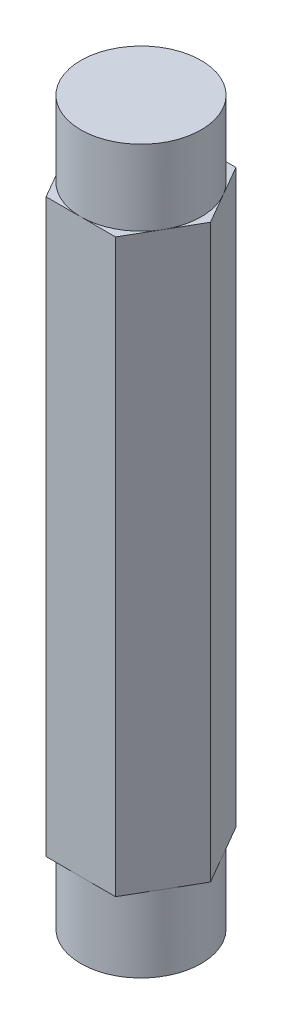
ISO-10303-21;
HEADER;
FILE_DESCRIPTION(('STEP AP214'),'2;1');
FILE_NAME('part.step','',(''),(''),'','','');
FILE_SCHEMA(('AUTOMOTIVE_DESIGN { 1 0 10303 214 1 1 1 1 }'));
ENDSEC;
DATA;
#1=APPLICATION_CONTEXT('core data for automotive mechanical design processes');
#2=APPLICATION_PROTOCOL_DEFINITION('international standard','automotive_design',2000,#1);
#3=PRODUCT_CONTEXT('',#1,'mechanical');
#4=PRODUCT('Part','Part','',(#3));
#5=PRODUCT_RELATED_PRODUCT_CATEGORY('part','',(#4));
#6=PRODUCT_DEFINITION_FORMATION('','',#4);
#7=PRODUCT_DEFINITION_CONTEXT('part definition',#1,'design');
#8=PRODUCT_DEFINITION('design','',#6,#7);
#9=PRODUCT_DEFINITION_SHAPE('','',#8);
#10=(LENGTH_UNIT() NAMED_UNIT(*) SI_UNIT(.MILLI.,.METRE.));
#11=(NAMED_UNIT(*) PLANE_ANGLE_UNIT() SI_UNIT($,.RADIAN.));
#12=(NAMED_UNIT(*) SI_UNIT($,.STERADIAN.) SOLID_ANGLE_UNIT());
#13=UNCERTAINTY_MEASURE_WITH_UNIT(LENGTH_MEASURE(1.E-05),#10,'distance_accuracy_value','');
#14=(GEOMETRIC_REPRESENTATION_CONTEXT(3) GLOBAL_UNCERTAINTY_ASSIGNED_CONTEXT((#13)) GLOBAL_UNIT_ASSIGNED_CONTEXT((#10,
#11,#12)) REPRESENTATION_CONTEXT('',''));
#15=CARTESIAN_POINT('',(0.,0.,0.));
#16=DIRECTION('',(0.,0.,1.));
#17=DIRECTION('',(1.,0.,0.));
#18=AXIS2_PLACEMENT_3D('',#15,#16,#17);
#19=CARTESIAN_POINT('',(-3.66617420935412,38.1,6.35));
#20=DIRECTION('',(0.,0.,-1.));
#21=DIRECTION('',(-1.,0.,0.));
#22=AXIS2_PLACEMENT_3D('',#19,#20,#21);
#23=PLANE('',#22);
#24=DIRECTION('',(-1.,0.,0.));
#25=VECTOR('',#24,1.);
#26=CARTESIAN_POINT('',(-3.66617420935412,-30.1498,6.35));
#27=LINE('',#26,#25);
#28=CARTESIAN_POINT('',(3.66617420935413,-30.1498,6.35));
#29=VERTEX_POINT('',#28);
#30=CARTESIAN_POINT('',(0.,-30.1498,6.35));
#31=VERTEX_POINT('',#30);
#32=EDGE_CURVE('E138',#29,#31,#27,.T.);
#33=ORIENTED_EDGE('',*,*,#32,.F.);
#34=DIRECTION('',(0.,-1.,0.));
#35=VECTOR('',#34,1.);
#36=CARTESIAN_POINT('',(3.66617420935412,38.1,6.35));
#37=LINE('',#36,#35);
#38=CARTESIAN_POINT('',(3.66617420935412,30.1498,6.35));
#39=VERTEX_POINT('',#38);
#40=EDGE_CURVE('E232',#39,#29,#37,.T.);
#41=ORIENTED_EDGE('',*,*,#40,.F.);
#42=DIRECTION('',(1.,0.,0.));
#43=VECTOR('',#42,1.);
#44=CARTESIAN_POINT('',(-3.66617420935412,30.1498,6.35));
#45=LINE('',#44,#43);
#46=CARTESIAN_POINT('',(0.,30.1498,6.35));
#47=VERTEX_POINT('',#46);
#48=EDGE_CURVE('E210',#47,#39,#45,.T.);
#49=ORIENTED_EDGE('',*,*,#48,.F.);
#50=CARTESIAN_POINT('',(-3.66617420935412,30.1498,6.35));
#51=VERTEX_POINT('',#50);
#52=EDGE_CURVE('E213',#51,#47,#45,.T.);
#53=ORIENTED_EDGE('',*,*,#52,.F.);
#54=DIRECTION('',(0.,-1.,0.));
#55=VECTOR('',#54,1.);
#56=CARTESIAN_POINT('',(-3.66617420935412,38.1,6.35));
#57=LINE('',#56,#55);
#58=CARTESIAN_POINT('',(-3.66617420935412,-30.1498,6.35));
#59=VERTEX_POINT('',#58);
#60=EDGE_CURVE('E172',#51,#59,#57,.T.);
#61=ORIENTED_EDGE('',*,*,#60,.T.);
#62=EDGE_CURVE('E151',#31,#59,#27,.T.);
#63=ORIENTED_EDGE('',*,*,#62,.F.);
#64=EDGE_LOOP('',(#33,#41,#49,#53,#61,#63));
#65=FACE_BOUND('',#64,.T.);
#66=ADVANCED_FACE('F47',(#65),#23,.F.);
#67=CARTESIAN_POINT('',(3.66617420935412,38.1,6.35));
#68=DIRECTION('',(-0.866025403784439,0.,-0.5));
#69=DIRECTION('',(-0.5,0.,0.866025403784439));
#70=AXIS2_PLACEMENT_3D('',#67,#68,#69);
#71=PLANE('',#70);
#72=DIRECTION('',(-0.5,0.,0.866025403784439));
#73=VECTOR('',#72,1.);
#74=CARTESIAN_POINT('',(3.66617420935412,-30.1498,6.35));
#75=LINE('',#74,#73);
#76=CARTESIAN_POINT('',(7.33234841870825,-30.1498,0.));
#77=VERTEX_POINT('',#76);
#78=CARTESIAN_POINT('',(5.49926131403119,-30.1498,3.175));
#79=VERTEX_POINT('',#78);
#80=EDGE_CURVE('E183',#77,#79,#75,.T.);
#81=ORIENTED_EDGE('',*,*,#80,.F.);
#82=DIRECTION('',(0.,-1.,0.));
#83=VECTOR('',#82,1.);
#84=CARTESIAN_POINT('',(7.33234841870825,38.1,0.));
#85=LINE('',#84,#83);
#86=CARTESIAN_POINT('',(7.33234841870825,30.1498,0.));
#87=VERTEX_POINT('',#86);
#88=EDGE_CURVE('E228',#87,#77,#85,.T.);
#89=ORIENTED_EDGE('',*,*,#88,.F.);
#90=DIRECTION('',(0.5,0.,-0.866025403784439));
#91=VECTOR('',#90,1.);
#92=CARTESIAN_POINT('',(3.66617420935412,30.1498,6.35));
#93=LINE('',#92,#91);
#94=CARTESIAN_POINT('',(5.49926131403119,30.1498,3.175));
#95=VERTEX_POINT('',#94);
#96=EDGE_CURVE('E206',#95,#87,#93,.T.);
#97=ORIENTED_EDGE('',*,*,#96,.F.);
#98=EDGE_CURVE('E209',#39,#95,#93,.T.);
#99=ORIENTED_EDGE('',*,*,#98,.F.);
#100=ORIENTED_EDGE('',*,*,#40,.T.);
#101=EDGE_CURVE('E144',#79,#29,#75,.T.);
#102=ORIENTED_EDGE('',*,*,#101,.F.);
#103=EDGE_LOOP('',(#81,#89,#97,#99,#100,#102));
#104=FACE_BOUND('',#103,.T.);
#105=ADVANCED_FACE('F321',(#104),#71,.F.);
#106=CARTESIAN_POINT('',(7.33234841870825,38.1,0.));
#107=DIRECTION('',(-0.866025403784439,0.,0.5));
#108=DIRECTION('',(0.5,0.,0.866025403784439));
#109=AXIS2_PLACEMENT_3D('',#106,#107,#108);
#110=PLANE('',#109);
#111=DIRECTION('',(0.5,0.,0.866025403784439));
#112=VECTOR('',#111,1.);
#113=CARTESIAN_POINT('',(7.33234841870825,-30.1498,0.));
#114=LINE('',#113,#112);
#115=CARTESIAN_POINT('',(3.66617420935412,-30.1498,-6.35));
#116=VERTEX_POINT('',#115);
#117=CARTESIAN_POINT('',(5.49926131403119,-30.1498,-3.175));
#118=VERTEX_POINT('',#117);
#119=EDGE_CURVE('E187',#116,#118,#114,.T.);
#120=ORIENTED_EDGE('',*,*,#119,.F.);
#121=DIRECTION('',(0.,-1.,0.));
#122=VECTOR('',#121,1.);
#123=CARTESIAN_POINT('',(3.66617420935412,38.1,-6.35));
#124=LINE('',#123,#122);
#125=CARTESIAN_POINT('',(3.66617420935412,30.1498,-6.35));
#126=VERTEX_POINT('',#125);
#127=EDGE_CURVE('E224',#126,#116,#124,.T.);
#128=ORIENTED_EDGE('',*,*,#127,.F.);
#129=DIRECTION('',(-0.5,0.,-0.866025403784439));
#130=VECTOR('',#129,1.);
#131=CARTESIAN_POINT('',(7.33234841870825,30.1498,0.));
#132=LINE('',#131,#130);
#133=CARTESIAN_POINT('',(5.49926131403119,30.1498,-3.175));
#134=VERTEX_POINT('',#133);
#135=EDGE_CURVE('E202',#134,#126,#132,.T.);
#136=ORIENTED_EDGE('',*,*,#135,.F.);
#137=EDGE_CURVE('E205',#87,#134,#132,.T.);
#138=ORIENTED_EDGE('',*,*,#137,.F.);
#139=ORIENTED_EDGE('',*,*,#88,.T.);
#140=EDGE_CURVE('E184',#118,#77,#114,.T.);
#141=ORIENTED_EDGE('',*,*,#140,.F.);
#142=EDGE_LOOP('',(#120,#128,#136,#138,#139,#141));
#143=FACE_BOUND('',#142,.T.);
#144=ADVANCED_FACE('F305',(#143),#110,.F.);
#145=CARTESIAN_POINT('',(3.66617420935412,38.1,-6.35));
#146=DIRECTION('',(0.,0.,1.));
#147=DIRECTION('',(1.,0.,0.));
#148=AXIS2_PLACEMENT_3D('',#145,#146,#147);
#149=PLANE('',#148);
#150=DIRECTION('',(1.,0.,0.));
#151=VECTOR('',#150,1.);
#152=CARTESIAN_POINT('',(3.66617420935412,-30.1498,-6.35));
#153=LINE('',#152,#151);
#154=CARTESIAN_POINT('',(-3.66617420935412,-30.1498,-6.35));
#155=VERTEX_POINT('',#154);
#156=CARTESIAN_POINT('',(0.,-30.1498,-6.35));
#157=VERTEX_POINT('',#156);
#158=EDGE_CURVE('E177',#155,#157,#153,.T.);
#159=ORIENTED_EDGE('',*,*,#158,.F.);
#160=DIRECTION('',(0.,-1.,0.));
#161=VECTOR('',#160,1.);
#162=CARTESIAN_POINT('',(-3.66617420935412,38.1,-6.35));
#163=LINE('',#162,#161);
#164=CARTESIAN_POINT('',(-3.66617420935412,30.1498,-6.35));
#165=VERTEX_POINT('',#164);
#166=EDGE_CURVE('E220',#165,#155,#163,.T.);
#167=ORIENTED_EDGE('',*,*,#166,.F.);
#168=DIRECTION('',(-1.,0.,0.));
#169=VECTOR('',#168,1.);
#170=CARTESIAN_POINT('',(3.66617420935412,30.1498,-6.35));
#171=LINE('',#170,#169);
#172=CARTESIAN_POINT('',(0.,30.1498,-6.35));
#173=VERTEX_POINT('',#172);
#174=EDGE_CURVE('E198',#173,#165,#171,.T.);
#175=ORIENTED_EDGE('',*,*,#174,.F.);
#176=EDGE_CURVE('E201',#126,#173,#171,.T.);
#177=ORIENTED_EDGE('',*,*,#176,.F.);
#178=ORIENTED_EDGE('',*,*,#127,.T.);
#179=EDGE_CURVE('E180',#157,#116,#153,.T.);
#180=ORIENTED_EDGE('',*,*,#179,.F.);
#181=EDGE_LOOP('',(#159,#167,#175,#177,#178,#180));
#182=FACE_BOUND('',#181,.T.);
#183=ADVANCED_FACE('F291',(#182),#149,.F.);
#184=CARTESIAN_POINT('',(-3.66617420935412,38.1,-6.35));
#185=DIRECTION('',(0.866025403784439,0.,0.5));
#186=DIRECTION('',(0.5,0.,-0.866025403784439));
#187=AXIS2_PLACEMENT_3D('',#184,#185,#186);
#188=PLANE('',#187);
#189=DIRECTION('',(0.5,0.,-0.866025403784439));
#190=VECTOR('',#189,1.);
#191=CARTESIAN_POINT('',(-3.66617420935412,-30.1498,-6.35));
#192=LINE('',#191,#190);
#193=CARTESIAN_POINT('',(-7.33234841870825,-30.1498,0.));
#194=VERTEX_POINT('',#193);
#195=CARTESIAN_POINT('',(-5.49926131403118,-30.1498,-3.175));
#196=VERTEX_POINT('',#195);
#197=EDGE_CURVE('E168',#194,#196,#192,.T.);
#198=ORIENTED_EDGE('',*,*,#197,.F.);
#199=DIRECTION('',(0.,-1.,0.));
#200=VECTOR('',#199,1.);
#201=CARTESIAN_POINT('',(-7.33234841870825,38.1,0.));
#202=LINE('',#201,#200);
#203=CARTESIAN_POINT('',(-7.33234841870825,30.1498,0.));
#204=VERTEX_POINT('',#203);
#205=EDGE_CURVE('E216',#204,#194,#202,.T.);
#206=ORIENTED_EDGE('',*,*,#205,.F.);
#207=DIRECTION('',(-0.5,0.,0.866025403784439));
#208=VECTOR('',#207,1.);
#209=CARTESIAN_POINT('',(-3.66617420935412,30.1498,-6.35));
#210=LINE('',#209,#208);
#211=CARTESIAN_POINT('',(-5.49926131403118,30.1498,-3.175));
#212=VERTEX_POINT('',#211);
#213=EDGE_CURVE('E192',#212,#204,#210,.T.);
#214=ORIENTED_EDGE('',*,*,#213,.F.);
#215=EDGE_CURVE('E197',#165,#212,#210,.T.);
#216=ORIENTED_EDGE('',*,*,#215,.F.);
#217=ORIENTED_EDGE('',*,*,#166,.T.);
#218=EDGE_CURVE('E150',#196,#155,#192,.T.);
#219=ORIENTED_EDGE('',*,*,#218,.F.);
#220=EDGE_LOOP('',(#198,#206,#214,#216,#217,#219));
#221=FACE_BOUND('',#220,.T.);
#222=ADVANCED_FACE('F294',(#221),#188,.F.);
#223=CARTESIAN_POINT('',(-7.33234841870825,38.1,0.));
#224=DIRECTION('',(0.866025403784439,0.,-0.5));
#225=DIRECTION('',(-0.5,0.,-0.866025403784439));
#226=AXIS2_PLACEMENT_3D('',#223,#224,#225);
#227=PLANE('',#226);
#228=DIRECTION('',(-0.5,0.,-0.866025403784439));
#229=VECTOR('',#228,1.);
#230=CARTESIAN_POINT('',(-7.33234841870825,-30.1498,0.));
#231=LINE('',#230,#229);
#232=CARTESIAN_POINT('',(-5.49926131403119,-30.1498,3.175));
#233=VERTEX_POINT('',#232);
#234=EDGE_CURVE('E12',#59,#233,#231,.T.);
#235=ORIENTED_EDGE('',*,*,#234,.F.);
#236=ORIENTED_EDGE('',*,*,#60,.F.);
#237=DIRECTION('',(0.5,0.,0.866025403784439));
#238=VECTOR('',#237,1.);
#239=CARTESIAN_POINT('',(-7.33234841870825,30.1498,0.));
#240=LINE('',#239,#238);
#241=CARTESIAN_POINT('',(-5.49926131403119,30.1498,3.175));
#242=VERTEX_POINT('',#241);
#243=EDGE_CURVE('E239',#242,#51,#240,.T.);
#244=ORIENTED_EDGE('',*,*,#243,.F.);
#245=EDGE_CURVE('E241',#204,#242,#240,.T.);
#246=ORIENTED_EDGE('',*,*,#245,.F.);
#247=ORIENTED_EDGE('',*,*,#205,.T.);
#248=EDGE_CURVE('E50',#233,#194,#231,.T.);
#249=ORIENTED_EDGE('',*,*,#248,.F.);
#250=EDGE_LOOP('',(#235,#236,#244,#246,#247,#249));
#251=FACE_BOUND('',#250,.T.);
#252=ADVANCED_FACE('F257',(#251),#227,.F.);
#253=CARTESIAN_POINT('',(0.,30.1498,0.));
#254=DIRECTION('',(0.,1.,0.));
#255=DIRECTION('',(0.,0.,1.));
#256=AXIS2_PLACEMENT_3D('',#253,#254,#255);
#257=PLANE('',#256);
#258=ORIENTED_EDGE('',*,*,#52,.T.);
#259=CARTESIAN_POINT('',(0.,30.1498,0.));
#260=DIRECTION('',(0.,1.,0.));
#261=DIRECTION('',(0.,0.,1.));
#262=AXIS2_PLACEMENT_3D('',#259,#260,#261);
#263=CIRCLE('',#262,6.35);
#264=EDGE_CURVE('E194',#242,#47,#263,.T.);
#265=ORIENTED_EDGE('',*,*,#264,.F.);
#266=ORIENTED_EDGE('',*,*,#243,.T.);
#267=EDGE_LOOP('',(#258,#265,#266));
#268=FACE_BOUND('',#267,.T.);
#269=ADVANCED_FACE('F259',(#268),#257,.T.);
#270=ORIENTED_EDGE('',*,*,#48,.T.);
#271=ORIENTED_EDGE('',*,*,#98,.T.);
#272=EDGE_CURVE('E188',#47,#95,#263,.T.);
#273=ORIENTED_EDGE('',*,*,#272,.F.);
#274=EDGE_LOOP('',(#270,#271,#273));
#275=FACE_BOUND('',#274,.T.);
#276=ADVANCED_FACE('F331',(#275),#257,.T.);
#277=ORIENTED_EDGE('',*,*,#96,.T.);
#278=ORIENTED_EDGE('',*,*,#137,.T.);
#279=EDGE_CURVE('E193',#95,#134,#263,.T.);
#280=ORIENTED_EDGE('',*,*,#279,.F.);
#281=EDGE_LOOP('',(#277,#278,#280));
#282=FACE_BOUND('',#281,.T.);
#283=ADVANCED_FACE('F325',(#282),#257,.T.);
#284=ORIENTED_EDGE('',*,*,#135,.T.);
#285=ORIENTED_EDGE('',*,*,#176,.T.);
#286=EDGE_CURVE('E269',#134,#173,#263,.T.);
#287=ORIENTED_EDGE('',*,*,#286,.F.);
#288=EDGE_LOOP('',(#284,#285,#287));
#289=FACE_BOUND('',#288,.T.);
#290=ADVANCED_FACE('F326',(#289),#257,.T.);
#291=ORIENTED_EDGE('',*,*,#174,.T.);
#292=ORIENTED_EDGE('',*,*,#215,.T.);
#293=EDGE_CURVE('E272',#173,#212,#263,.T.);
#294=ORIENTED_EDGE('',*,*,#293,.F.);
#295=EDGE_LOOP('',(#291,#292,#294));
#296=FACE_BOUND('',#295,.T.);
#297=ADVANCED_FACE('F297',(#296),#257,.T.);
#298=ORIENTED_EDGE('',*,*,#213,.T.);
#299=ORIENTED_EDGE('',*,*,#245,.T.);
#300=EDGE_CURVE('E70',#212,#242,#263,.T.);
#301=ORIENTED_EDGE('',*,*,#300,.F.);
#302=EDGE_LOOP('',(#298,#299,#301));
#303=FACE_BOUND('',#302,.T.);
#304=ADVANCED_FACE('F253',(#303),#257,.T.);
#305=CARTESIAN_POINT('',(0.,30.1498,0.));
#306=DIRECTION('',(0.,1.,0.));
#307=DIRECTION('',(0.,0.,1.));
#308=AXIS2_PLACEMENT_3D('',#305,#306,#307);
#309=CYLINDRICAL_SURFACE('',#308,6.35);
#310=CARTESIAN_POINT('',(0.,38.1,0.));
#311=DIRECTION('',(0.,1.,0.));
#312=DIRECTION('',(0.,0.,1.));
#313=AXIS2_PLACEMENT_3D('',#310,#311,#312);
#314=CIRCLE('',#313,6.35);
#315=CARTESIAN_POINT('',(0.,38.1,6.35));
#316=VERTEX_POINT('',#315);
#317=EDGE_CURVE('E235',#316,#316,#314,.T.);
#318=ORIENTED_EDGE('',*,*,#317,.F.);
#319=EDGE_LOOP('',(#318));
#320=FACE_BOUND('',#319,.T.);
#321=ORIENTED_EDGE('',*,*,#264,.T.);
#322=ORIENTED_EDGE('',*,*,#272,.T.);
#323=ORIENTED_EDGE('',*,*,#279,.T.);
#324=ORIENTED_EDGE('',*,*,#286,.T.);
#325=ORIENTED_EDGE('',*,*,#293,.T.);
#326=ORIENTED_EDGE('',*,*,#300,.T.);
#327=EDGE_LOOP('',(#321,#322,#323,#324,#325,#326));
#328=FACE_BOUND('',#327,.T.);
#329=ADVANCED_FACE('F327',(#320,#328),#309,.T.);
#330=CARTESIAN_POINT('',(0.,38.1,0.));
#331=DIRECTION('',(0.,1.,0.));
#332=DIRECTION('',(0.,0.,1.));
#333=AXIS2_PLACEMENT_3D('',#330,#331,#332);
#334=PLANE('',#333);
#335=ORIENTED_EDGE('',*,*,#317,.T.);
#336=EDGE_LOOP('',(#335));
#337=FACE_BOUND('',#336,.T.);
#338=ADVANCED_FACE('F358',(#337),#334,.T.);
#339=CARTESIAN_POINT('',(0.,-30.1498,0.));
#340=DIRECTION('',(0.,-1.,0.));
#341=DIRECTION('',(0.,0.,-1.));
#342=AXIS2_PLACEMENT_3D('',#339,#340,#341);
#343=PLANE('',#342);
#344=ORIENTED_EDGE('',*,*,#119,.T.);
#345=CARTESIAN_POINT('',(0.,-30.1498,0.));
#346=DIRECTION('',(0.,1.,0.));
#347=DIRECTION('',(0.,0.,1.));
#348=AXIS2_PLACEMENT_3D('',#345,#346,#347);
#349=CIRCLE('',#348,6.35);
#350=EDGE_CURVE('E311',#118,#157,#349,.T.);
#351=ORIENTED_EDGE('',*,*,#350,.T.);
#352=ORIENTED_EDGE('',*,*,#179,.T.);
#353=EDGE_LOOP('',(#344,#351,#352));
#354=FACE_BOUND('',#353,.T.);
#355=ADVANCED_FACE('F310',(#354),#343,.T.);
#356=ORIENTED_EDGE('',*,*,#140,.T.);
#357=ORIENTED_EDGE('',*,*,#80,.T.);
#358=EDGE_CURVE('E166',#79,#118,#349,.T.);
#359=ORIENTED_EDGE('',*,*,#358,.T.);
#360=EDGE_LOOP('',(#356,#357,#359));
#361=FACE_BOUND('',#360,.T.);
#362=ADVANCED_FACE('F314',(#361),#343,.T.);
#363=ORIENTED_EDGE('',*,*,#101,.T.);
#364=ORIENTED_EDGE('',*,*,#32,.T.);
#365=EDGE_CURVE('E142',#31,#79,#349,.T.);
#366=ORIENTED_EDGE('',*,*,#365,.T.);
#367=EDGE_LOOP('',(#363,#364,#366));
#368=FACE_BOUND('',#367,.T.);
#369=ADVANCED_FACE('F140',(#368),#343,.T.);
#370=ORIENTED_EDGE('',*,*,#158,.T.);
#371=EDGE_CURVE('E285',#157,#196,#349,.T.);
#372=ORIENTED_EDGE('',*,*,#371,.T.);
#373=ORIENTED_EDGE('',*,*,#218,.T.);
#374=EDGE_LOOP('',(#370,#372,#373));
#375=FACE_BOUND('',#374,.T.);
#376=ADVANCED_FACE('F283',(#375),#343,.T.);
#377=ORIENTED_EDGE('',*,*,#62,.T.);
#378=ORIENTED_EDGE('',*,*,#234,.T.);
#379=EDGE_CURVE('E154',#233,#31,#349,.T.);
#380=ORIENTED_EDGE('',*,*,#379,.T.);
#381=EDGE_LOOP('',(#377,#378,#380));
#382=FACE_BOUND('',#381,.T.);
#383=ADVANCED_FACE('F155',(#382),#343,.T.);
#384=ORIENTED_EDGE('',*,*,#197,.T.);
#385=EDGE_CURVE('E62',#196,#233,#349,.T.);
#386=ORIENTED_EDGE('',*,*,#385,.T.);
#387=ORIENTED_EDGE('',*,*,#248,.T.);
#388=EDGE_LOOP('',(#384,#386,#387));
#389=FACE_BOUND('',#388,.T.);
#390=ADVANCED_FACE('F365',(#389),#343,.T.);
#391=CARTESIAN_POINT('',(0.,-30.1498,0.));
#392=DIRECTION('',(0.,-1.,0.));
#393=DIRECTION('',(0.,0.,-1.));
#394=AXIS2_PLACEMENT_3D('',#391,#392,#393);
#395=CYLINDRICAL_SURFACE('',#394,6.35);
#396=ORIENTED_EDGE('',*,*,#365,.F.);
#397=ORIENTED_EDGE('',*,*,#379,.F.);
#398=ORIENTED_EDGE('',*,*,#385,.F.);
#399=ORIENTED_EDGE('',*,*,#371,.F.);
#400=ORIENTED_EDGE('',*,*,#350,.F.);
#401=ORIENTED_EDGE('',*,*,#358,.F.);
#402=EDGE_LOOP('',(#396,#397,#398,#399,#400,#401));
#403=FACE_BOUND('',#402,.T.);
#404=CARTESIAN_POINT('',(0.,-38.1,0.));
#405=DIRECTION('',(0.,1.,0.));
#406=DIRECTION('',(0.,0.,1.));
#407=AXIS2_PLACEMENT_3D('',#404,#405,#406);
#408=CIRCLE('',#407,6.35);
#409=CARTESIAN_POINT('',(0.,-38.1,6.35));
#410=VERTEX_POINT('',#409);
#411=EDGE_CURVE('E242',#410,#410,#408,.F.);
#412=ORIENTED_EDGE('',*,*,#411,.F.);
#413=EDGE_LOOP('',(#412));
#414=FACE_BOUND('',#413,.T.);
#415=ADVANCED_FACE('F162',(#403,#414),#395,.T.);
#416=CARTESIAN_POINT('',(0.,-38.1,0.));
#417=DIRECTION('',(0.,1.,0.));
#418=DIRECTION('',(0.,0.,1.));
#419=AXIS2_PLACEMENT_3D('',#416,#417,#418);
#420=PLANE('',#419);
#421=ORIENTED_EDGE('',*,*,#411,.T.);
#422=EDGE_LOOP('',(#421));
#423=FACE_BOUND('',#422,.T.);
#424=ADVANCED_FACE('F356',(#423),#420,.F.);
#425=CLOSED_SHELL('',(#66,#105,#144,#183,#222,#252,#269,#276,#283,#290,#297,#304,#329,#338,#355,
#362,#369,#376,#383,#390,#415,#424));
#426=MANIFOLD_SOLID_BREP('B2',#425);
#427=ADVANCED_BREP_SHAPE_REPRESENTATION('',(#18,#426),#14);
#428=SHAPE_DEFINITION_REPRESENTATION(#9,#427);
ENDSEC;
END-ISO-10303-21;
